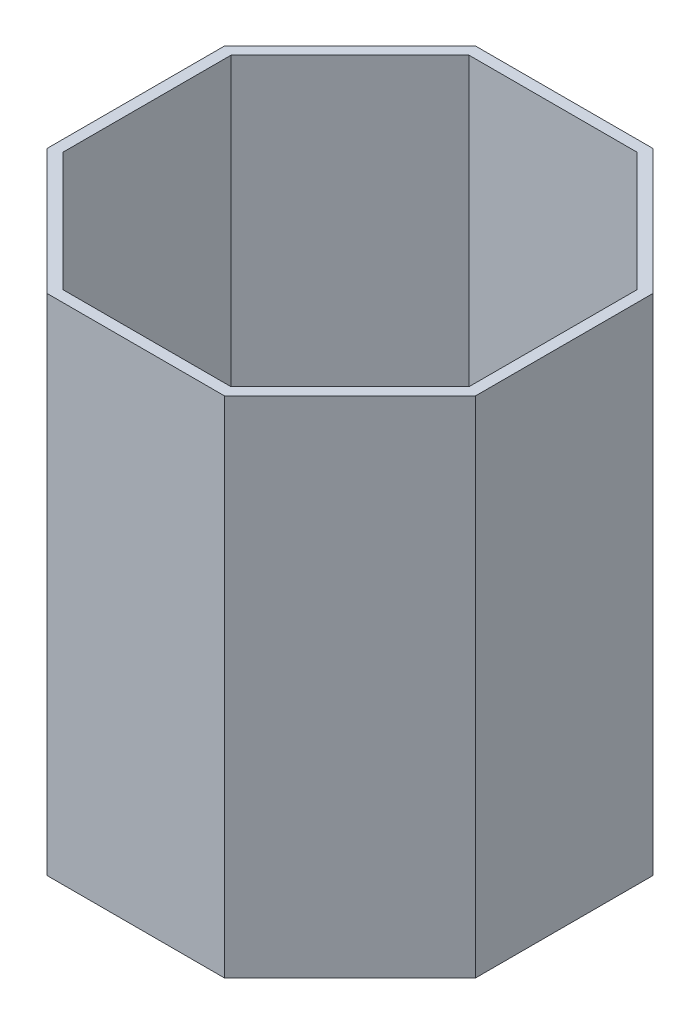
ISO-10303-21;
HEADER;
FILE_DESCRIPTION(('STEP AP214'),'2;1');
FILE_NAME('part.step','',(''),(''),'','','');
FILE_SCHEMA(('AUTOMOTIVE_DESIGN { 1 0 10303 214 1 1 1 1 }'));
ENDSEC;
DATA;
#1=APPLICATION_CONTEXT('core data for automotive mechanical design processes');
#2=APPLICATION_PROTOCOL_DEFINITION('international standard','automotive_design',2000,#1);
#3=PRODUCT_CONTEXT('',#1,'mechanical');
#4=PRODUCT('Part','Part','',(#3));
#5=PRODUCT_RELATED_PRODUCT_CATEGORY('part','',(#4));
#6=PRODUCT_DEFINITION_FORMATION('','',#4);
#7=PRODUCT_DEFINITION_CONTEXT('part definition',#1,'design');
#8=PRODUCT_DEFINITION('design','',#6,#7);
#9=PRODUCT_DEFINITION_SHAPE('','',#8);
#10=(LENGTH_UNIT() NAMED_UNIT(*) SI_UNIT(.MILLI.,.METRE.));
#11=(NAMED_UNIT(*) PLANE_ANGLE_UNIT() SI_UNIT($,.RADIAN.));
#12=(NAMED_UNIT(*) SI_UNIT($,.STERADIAN.) SOLID_ANGLE_UNIT());
#13=UNCERTAINTY_MEASURE_WITH_UNIT(LENGTH_MEASURE(1.E-05),#10,'distance_accuracy_value','');
#14=(GEOMETRIC_REPRESENTATION_CONTEXT(3) GLOBAL_UNCERTAINTY_ASSIGNED_CONTEXT((#13)) GLOBAL_UNIT_ASSIGNED_CONTEXT((#10,
#11,#12)) REPRESENTATION_CONTEXT('',''));
#15=CARTESIAN_POINT('',(0.,0.,0.));
#16=DIRECTION('',(0.,0.,1.));
#17=DIRECTION('',(1.,0.,0.));
#18=AXIS2_PLACEMENT_3D('',#15,#16,#17);
#19=CARTESIAN_POINT('',(0.,180.,0.));
#20=DIRECTION('',(0.,1.,0.));
#21=DIRECTION('',(0.,0.,1.));
#22=AXIS2_PLACEMENT_3D('',#19,#20,#21);
#23=PLANE('',#22);
#24=DIRECTION('',(-0.707106781186548,0.,0.707106781186548));
#25=VECTOR('',#24,1.);
#26=CARTESIAN_POINT('',(-31.6873375215418,180.,-76.5));
#27=LINE('',#26,#25);
#28=CARTESIAN_POINT('',(-31.6873375215418,180.,-76.5));
#29=VERTEX_POINT('',#28);
#30=CARTESIAN_POINT('',(-76.5,180.,-31.6873375215418));
#31=VERTEX_POINT('',#30);
#32=EDGE_CURVE('E213',#29,#31,#27,.T.);
#33=ORIENTED_EDGE('',*,*,#32,.T.);
#34=DIRECTION('',(0.,0.,1.));
#35=VECTOR('',#34,1.);
#36=CARTESIAN_POINT('',(-76.5,180.,-31.6873375215418));
#37=LINE('',#36,#35);
#38=CARTESIAN_POINT('',(-76.5,180.,31.6873375215418));
#39=VERTEX_POINT('',#38);
#40=EDGE_CURVE('E216',#31,#39,#37,.T.);
#41=ORIENTED_EDGE('',*,*,#40,.T.);
#42=DIRECTION('',(0.707106781186547,0.,0.707106781186548));
#43=VECTOR('',#42,1.);
#44=CARTESIAN_POINT('',(-76.5,180.,31.6873375215418));
#45=LINE('',#44,#43);
#46=CARTESIAN_POINT('',(-31.6873375215418,180.,76.5));
#47=VERTEX_POINT('',#46);
#48=EDGE_CURVE('E219',#39,#47,#45,.T.);
#49=ORIENTED_EDGE('',*,*,#48,.T.);
#50=DIRECTION('',(1.,0.,0.));
#51=VECTOR('',#50,1.);
#52=CARTESIAN_POINT('',(-31.6873375215418,180.,76.5));
#53=LINE('',#52,#51);
#54=CARTESIAN_POINT('',(31.6873375215418,180.,76.5));
#55=VERTEX_POINT('',#54);
#56=EDGE_CURVE('E221',#47,#55,#53,.T.);
#57=ORIENTED_EDGE('',*,*,#56,.T.);
#58=DIRECTION('',(0.707106781186547,0.,-0.707106781186548));
#59=VECTOR('',#58,1.);
#60=CARTESIAN_POINT('',(31.6873375215418,180.,76.5));
#61=LINE('',#60,#59);
#62=CARTESIAN_POINT('',(76.5,180.,31.6873375215418));
#63=VERTEX_POINT('',#62);
#64=EDGE_CURVE('E223',#55,#63,#61,.T.);
#65=ORIENTED_EDGE('',*,*,#64,.T.);
#66=DIRECTION('',(0.,0.,-1.));
#67=VECTOR('',#66,1.);
#68=CARTESIAN_POINT('',(76.5,180.,31.6873375215418));
#69=LINE('',#68,#67);
#70=CARTESIAN_POINT('',(76.5,180.,-31.6873375215418));
#71=VERTEX_POINT('',#70);
#72=EDGE_CURVE('E225',#63,#71,#69,.T.);
#73=ORIENTED_EDGE('',*,*,#72,.T.);
#74=DIRECTION('',(-0.707106781186548,0.,-0.707106781186548));
#75=VECTOR('',#74,1.);
#76=CARTESIAN_POINT('',(76.5,180.,-31.6873375215418));
#77=LINE('',#76,#75);
#78=CARTESIAN_POINT('',(31.6873375215418,180.,-76.5));
#79=VERTEX_POINT('',#78);
#80=EDGE_CURVE('E227',#71,#79,#77,.T.);
#81=ORIENTED_EDGE('',*,*,#80,.T.);
#82=DIRECTION('',(-1.,0.,0.));
#83=VECTOR('',#82,1.);
#84=CARTESIAN_POINT('',(31.6873375215418,180.,-76.5));
#85=LINE('',#84,#83);
#86=EDGE_CURVE('E229',#79,#29,#85,.T.);
#87=ORIENTED_EDGE('',*,*,#86,.T.);
#88=EDGE_LOOP('',(#33,#41,#49,#57,#65,#73,#81,#87));
#89=FACE_BOUND('',#88,.T.);
#90=DIRECTION('',(0.707106781186548,0.,0.707106781186547));
#91=VECTOR('',#90,1.);
#92=CARTESIAN_POINT('',(-72.5,180.,30.0304832720494));
#93=LINE('',#92,#91);
#94=CARTESIAN_POINT('',(-72.5,180.,30.0304832720494));
#95=VERTEX_POINT('',#94);
#96=CARTESIAN_POINT('',(-30.0304832720494,180.,72.5));
#97=VERTEX_POINT('',#96);
#98=EDGE_CURVE('E156',#95,#97,#93,.T.);
#99=ORIENTED_EDGE('',*,*,#98,.F.);
#100=DIRECTION('',(0.,0.,1.));
#101=VECTOR('',#100,1.);
#102=CARTESIAN_POINT('',(-72.5,180.,-30.0304832720494));
#103=LINE('',#102,#101);
#104=CARTESIAN_POINT('',(-72.5,180.,-30.0304832720494));
#105=VERTEX_POINT('',#104);
#106=EDGE_CURVE('E148',#105,#95,#103,.T.);
#107=ORIENTED_EDGE('',*,*,#106,.F.);
#108=DIRECTION('',(-0.707106781186548,0.,0.707106781186547));
#109=VECTOR('',#108,1.);
#110=CARTESIAN_POINT('',(-30.0304832720494,180.,-72.5));
#111=LINE('',#110,#109);
#112=CARTESIAN_POINT('',(-30.0304832720494,180.,-72.5));
#113=VERTEX_POINT('',#112);
#114=EDGE_CURVE('E181',#113,#105,#111,.T.);
#115=ORIENTED_EDGE('',*,*,#114,.F.);
#116=DIRECTION('',(-1.,0.,0.));
#117=VECTOR('',#116,1.);
#118=CARTESIAN_POINT('',(30.0304832720494,180.,-72.5));
#119=LINE('',#118,#117);
#120=CARTESIAN_POINT('',(30.0304832720494,180.,-72.5));
#121=VERTEX_POINT('',#120);
#122=EDGE_CURVE('E179',#121,#113,#119,.T.);
#123=ORIENTED_EDGE('',*,*,#122,.F.);
#124=DIRECTION('',(-0.707106781186548,0.,-0.707106781186547));
#125=VECTOR('',#124,1.);
#126=CARTESIAN_POINT('',(72.5,180.,-30.0304832720495));
#127=LINE('',#126,#125);
#128=CARTESIAN_POINT('',(72.5,180.,-30.0304832720495));
#129=VERTEX_POINT('',#128);
#130=EDGE_CURVE('E177',#129,#121,#127,.T.);
#131=ORIENTED_EDGE('',*,*,#130,.F.);
#132=DIRECTION('',(0.,0.,-1.));
#133=VECTOR('',#132,1.);
#134=CARTESIAN_POINT('',(72.5,180.,30.0304832720494));
#135=LINE('',#134,#133);
#136=CARTESIAN_POINT('',(72.5,180.,30.0304832720494));
#137=VERTEX_POINT('',#136);
#138=EDGE_CURVE('E175',#137,#129,#135,.T.);
#139=ORIENTED_EDGE('',*,*,#138,.F.);
#140=DIRECTION('',(0.707106781186547,0.,-0.707106781186548));
#141=VECTOR('',#140,1.);
#142=CARTESIAN_POINT('',(30.0304832720495,180.,72.5));
#143=LINE('',#142,#141);
#144=CARTESIAN_POINT('',(30.0304832720495,180.,72.5));
#145=VERTEX_POINT('',#144);
#146=EDGE_CURVE('E171',#145,#137,#143,.T.);
#147=ORIENTED_EDGE('',*,*,#146,.F.);
#148=DIRECTION('',(1.,0.,0.));
#149=VECTOR('',#148,1.);
#150=CARTESIAN_POINT('',(-30.0304832720494,180.,72.5));
#151=LINE('',#150,#149);
#152=EDGE_CURVE('E169',#97,#145,#151,.T.);
#153=ORIENTED_EDGE('',*,*,#152,.F.);
#154=EDGE_LOOP('',(#99,#107,#115,#123,#131,#139,#147,#153));
#155=FACE_BOUND('',#154,.T.);
#156=ADVANCED_FACE('F35',(#89,#155),#23,.T.);
#157=CARTESIAN_POINT('',(0.,0.,0.));
#158=DIRECTION('',(0.,1.,0.));
#159=DIRECTION('',(0.,0.,1.));
#160=AXIS2_PLACEMENT_3D('',#157,#158,#159);
#161=PLANE('',#160);
#162=DIRECTION('',(-0.707106781186548,0.,0.707106781186548));
#163=VECTOR('',#162,1.);
#164=CARTESIAN_POINT('',(-31.6873375215418,0.,-76.5));
#165=LINE('',#164,#163);
#166=CARTESIAN_POINT('',(-31.6873375215418,0.,-76.5));
#167=VERTEX_POINT('',#166);
#168=CARTESIAN_POINT('',(-76.5,0.,-31.6873375215418));
#169=VERTEX_POINT('',#168);
#170=EDGE_CURVE('E164',#167,#169,#165,.T.);
#171=ORIENTED_EDGE('',*,*,#170,.F.);
#172=DIRECTION('',(-1.,0.,0.));
#173=VECTOR('',#172,1.);
#174=CARTESIAN_POINT('',(31.6873375215418,0.,-76.5));
#175=LINE('',#174,#173);
#176=CARTESIAN_POINT('',(31.6873375215418,0.,-76.5));
#177=VERTEX_POINT('',#176);
#178=EDGE_CURVE('E217',#177,#167,#175,.T.);
#179=ORIENTED_EDGE('',*,*,#178,.F.);
#180=DIRECTION('',(-0.707106781186548,0.,-0.707106781186548));
#181=VECTOR('',#180,1.);
#182=CARTESIAN_POINT('',(76.5,0.,-31.6873375215418));
#183=LINE('',#182,#181);
#184=CARTESIAN_POINT('',(76.5,0.,-31.6873375215418));
#185=VERTEX_POINT('',#184);
#186=EDGE_CURVE('E244',#185,#177,#183,.T.);
#187=ORIENTED_EDGE('',*,*,#186,.F.);
#188=DIRECTION('',(0.,0.,-1.));
#189=VECTOR('',#188,1.);
#190=CARTESIAN_POINT('',(76.5,0.,31.6873375215418));
#191=LINE('',#190,#189);
#192=CARTESIAN_POINT('',(76.5,0.,31.6873375215418));
#193=VERTEX_POINT('',#192);
#194=EDGE_CURVE('E242',#193,#185,#191,.T.);
#195=ORIENTED_EDGE('',*,*,#194,.F.);
#196=DIRECTION('',(0.707106781186547,0.,-0.707106781186548));
#197=VECTOR('',#196,1.);
#198=CARTESIAN_POINT('',(31.6873375215418,0.,76.5));
#199=LINE('',#198,#197);
#200=CARTESIAN_POINT('',(31.6873375215418,0.,76.5));
#201=VERTEX_POINT('',#200);
#202=EDGE_CURVE('E240',#201,#193,#199,.T.);
#203=ORIENTED_EDGE('',*,*,#202,.F.);
#204=DIRECTION('',(1.,0.,0.));
#205=VECTOR('',#204,1.);
#206=CARTESIAN_POINT('',(-31.6873375215418,0.,76.5));
#207=LINE('',#206,#205);
#208=CARTESIAN_POINT('',(-31.6873375215418,0.,76.5));
#209=VERTEX_POINT('',#208);
#210=EDGE_CURVE('E238',#209,#201,#207,.T.);
#211=ORIENTED_EDGE('',*,*,#210,.F.);
#212=DIRECTION('',(0.707106781186547,0.,0.707106781186548));
#213=VECTOR('',#212,1.);
#214=CARTESIAN_POINT('',(-76.5,0.,31.6873375215418));
#215=LINE('',#214,#213);
#216=CARTESIAN_POINT('',(-76.5,0.,31.6873375215418));
#217=VERTEX_POINT('',#216);
#218=EDGE_CURVE('E236',#217,#209,#215,.T.);
#219=ORIENTED_EDGE('',*,*,#218,.F.);
#220=DIRECTION('',(0.,0.,1.));
#221=VECTOR('',#220,1.);
#222=CARTESIAN_POINT('',(-76.5,0.,-31.6873375215418));
#223=LINE('',#222,#221);
#224=EDGE_CURVE('E234',#169,#217,#223,.T.);
#225=ORIENTED_EDGE('',*,*,#224,.F.);
#226=EDGE_LOOP('',(#171,#179,#187,#195,#203,#211,#219,#225));
#227=FACE_BOUND('',#226,.T.);
#228=DIRECTION('',(0.,0.,1.));
#229=VECTOR('',#228,1.);
#230=CARTESIAN_POINT('',(-72.5,0.,-30.0304832720494));
#231=LINE('',#230,#229);
#232=CARTESIAN_POINT('',(-72.5,0.,-30.0304832720494));
#233=VERTEX_POINT('',#232);
#234=CARTESIAN_POINT('',(-72.5,0.,30.0304832720494));
#235=VERTEX_POINT('',#234);
#236=EDGE_CURVE('E58',#233,#235,#231,.T.);
#237=ORIENTED_EDGE('',*,*,#236,.T.);
#238=DIRECTION('',(0.707106781186548,0.,0.707106781186547));
#239=VECTOR('',#238,1.);
#240=CARTESIAN_POINT('',(-72.5,0.,30.0304832720494));
#241=LINE('',#240,#239);
#242=CARTESIAN_POINT('',(-30.0304832720494,0.,72.5));
#243=VERTEX_POINT('',#242);
#244=EDGE_CURVE('E163',#235,#243,#241,.T.);
#245=ORIENTED_EDGE('',*,*,#244,.T.);
#246=DIRECTION('',(1.,0.,0.));
#247=VECTOR('',#246,1.);
#248=CARTESIAN_POINT('',(-30.0304832720494,0.,72.5));
#249=LINE('',#248,#247);
#250=CARTESIAN_POINT('',(30.0304832720495,0.,72.5));
#251=VERTEX_POINT('',#250);
#252=EDGE_CURVE('E185',#243,#251,#249,.T.);
#253=ORIENTED_EDGE('',*,*,#252,.T.);
#254=DIRECTION('',(0.707106781186547,0.,-0.707106781186548));
#255=VECTOR('',#254,1.);
#256=CARTESIAN_POINT('',(30.0304832720495,0.,72.5));
#257=LINE('',#256,#255);
#258=CARTESIAN_POINT('',(72.5,0.,30.0304832720494));
#259=VERTEX_POINT('',#258);
#260=EDGE_CURVE('E188',#251,#259,#257,.T.);
#261=ORIENTED_EDGE('',*,*,#260,.T.);
#262=DIRECTION('',(0.,0.,-1.));
#263=VECTOR('',#262,1.);
#264=CARTESIAN_POINT('',(72.5,0.,30.0304832720494));
#265=LINE('',#264,#263);
#266=CARTESIAN_POINT('',(72.5,0.,-30.0304832720495));
#267=VERTEX_POINT('',#266);
#268=EDGE_CURVE('E191',#259,#267,#265,.T.);
#269=ORIENTED_EDGE('',*,*,#268,.T.);
#270=DIRECTION('',(-0.707106781186548,0.,-0.707106781186547));
#271=VECTOR('',#270,1.);
#272=CARTESIAN_POINT('',(72.5,0.,-30.0304832720495));
#273=LINE('',#272,#271);
#274=CARTESIAN_POINT('',(30.0304832720494,0.,-72.5));
#275=VERTEX_POINT('',#274);
#276=EDGE_CURVE('E194',#267,#275,#273,.T.);
#277=ORIENTED_EDGE('',*,*,#276,.T.);
#278=DIRECTION('',(-1.,0.,0.));
#279=VECTOR('',#278,1.);
#280=CARTESIAN_POINT('',(30.0304832720494,0.,-72.5));
#281=LINE('',#280,#279);
#282=CARTESIAN_POINT('',(-30.0304832720494,0.,-72.5));
#283=VERTEX_POINT('',#282);
#284=EDGE_CURVE('E197',#275,#283,#281,.T.);
#285=ORIENTED_EDGE('',*,*,#284,.T.);
#286=DIRECTION('',(-0.707106781186548,0.,0.707106781186547));
#287=VECTOR('',#286,1.);
#288=CARTESIAN_POINT('',(-30.0304832720494,0.,-72.5));
#289=LINE('',#288,#287);
#290=EDGE_CURVE('E157',#283,#233,#289,.T.);
#291=ORIENTED_EDGE('',*,*,#290,.T.);
#292=EDGE_LOOP('',(#237,#245,#253,#261,#269,#277,#285,#291));
#293=FACE_BOUND('',#292,.T.);
#294=ADVANCED_FACE('F274',(#227,#293),#161,.F.);
#295=CARTESIAN_POINT('',(-31.6873375215418,180.,-76.5));
#296=DIRECTION('',(0.707106781186547,0.,0.707106781186547));
#297=DIRECTION('',(0.707106781186548,0.,-0.707106781186547));
#298=AXIS2_PLACEMENT_3D('',#295,#296,#297);
#299=PLANE('',#298);
#300=ORIENTED_EDGE('',*,*,#170,.T.);
#301=DIRECTION('',(0.,-1.,0.));
#302=VECTOR('',#301,1.);
#303=CARTESIAN_POINT('',(-76.5,180.,-31.6873375215418));
#304=LINE('',#303,#302);
#305=EDGE_CURVE('E11',#31,#169,#304,.T.);
#306=ORIENTED_EDGE('',*,*,#305,.F.);
#307=ORIENTED_EDGE('',*,*,#32,.F.);
#308=DIRECTION('',(0.,-1.,0.));
#309=VECTOR('',#308,1.);
#310=CARTESIAN_POINT('',(-31.6873375215418,180.,-76.5));
#311=LINE('',#310,#309);
#312=EDGE_CURVE('E231',#29,#167,#311,.T.);
#313=ORIENTED_EDGE('',*,*,#312,.T.);
#314=EDGE_LOOP('',(#300,#306,#307,#313));
#315=FACE_BOUND('',#314,.T.);
#316=ADVANCED_FACE('F37',(#315),#299,.F.);
#317=CARTESIAN_POINT('',(-76.5,180.,-31.6873375215418));
#318=DIRECTION('',(1.,0.,0.));
#319=DIRECTION('',(0.,0.,-1.));
#320=AXIS2_PLACEMENT_3D('',#317,#318,#319);
#321=PLANE('',#320);
#322=ORIENTED_EDGE('',*,*,#224,.T.);
#323=DIRECTION('',(0.,-1.,0.));
#324=VECTOR('',#323,1.);
#325=CARTESIAN_POINT('',(-76.5,180.,31.6873375215418));
#326=LINE('',#325,#324);
#327=EDGE_CURVE('E43',#39,#217,#326,.T.);
#328=ORIENTED_EDGE('',*,*,#327,.F.);
#329=ORIENTED_EDGE('',*,*,#40,.F.);
#330=ORIENTED_EDGE('',*,*,#305,.T.);
#331=EDGE_LOOP('',(#322,#328,#329,#330));
#332=FACE_BOUND('',#331,.T.);
#333=ADVANCED_FACE('F291',(#332),#321,.F.);
#334=CARTESIAN_POINT('',(-76.5,180.,31.6873375215418));
#335=DIRECTION('',(0.707106781186547,0.,-0.707106781186547));
#336=DIRECTION('',(-0.707106781186548,0.,-0.707106781186548));
#337=AXIS2_PLACEMENT_3D('',#334,#335,#336);
#338=PLANE('',#337);
#339=ORIENTED_EDGE('',*,*,#218,.T.);
#340=DIRECTION('',(0.,-1.,0.));
#341=VECTOR('',#340,1.);
#342=CARTESIAN_POINT('',(-31.6873375215418,180.,76.5));
#343=LINE('',#342,#341);
#344=EDGE_CURVE('E261',#47,#209,#343,.T.);
#345=ORIENTED_EDGE('',*,*,#344,.F.);
#346=ORIENTED_EDGE('',*,*,#48,.F.);
#347=ORIENTED_EDGE('',*,*,#327,.T.);
#348=EDGE_LOOP('',(#339,#345,#346,#347));
#349=FACE_BOUND('',#348,.T.);
#350=ADVANCED_FACE('F268',(#349),#338,.F.);
#351=CARTESIAN_POINT('',(-31.6873375215418,180.,76.5));
#352=DIRECTION('',(0.,0.,-1.));
#353=DIRECTION('',(-1.,0.,0.));
#354=AXIS2_PLACEMENT_3D('',#351,#352,#353);
#355=PLANE('',#354);
#356=ORIENTED_EDGE('',*,*,#210,.T.);
#357=DIRECTION('',(0.,-1.,0.));
#358=VECTOR('',#357,1.);
#359=CARTESIAN_POINT('',(31.6873375215418,180.,76.5));
#360=LINE('',#359,#358);
#361=EDGE_CURVE('E258',#55,#201,#360,.T.);
#362=ORIENTED_EDGE('',*,*,#361,.F.);
#363=ORIENTED_EDGE('',*,*,#56,.F.);
#364=ORIENTED_EDGE('',*,*,#344,.T.);
#365=EDGE_LOOP('',(#356,#362,#363,#364));
#366=FACE_BOUND('',#365,.T.);
#367=ADVANCED_FACE('F280',(#366),#355,.F.);
#368=CARTESIAN_POINT('',(31.6873375215418,180.,76.5));
#369=DIRECTION('',(-0.707106781186547,0.,-0.707106781186547));
#370=DIRECTION('',(-0.707106781186547,0.,0.707106781186548));
#371=AXIS2_PLACEMENT_3D('',#368,#369,#370);
#372=PLANE('',#371);
#373=ORIENTED_EDGE('',*,*,#202,.T.);
#374=DIRECTION('',(0.,-1.,0.));
#375=VECTOR('',#374,1.);
#376=CARTESIAN_POINT('',(76.5,180.,31.6873375215418));
#377=LINE('',#376,#375);
#378=EDGE_CURVE('E255',#63,#193,#377,.T.);
#379=ORIENTED_EDGE('',*,*,#378,.F.);
#380=ORIENTED_EDGE('',*,*,#64,.F.);
#381=ORIENTED_EDGE('',*,*,#361,.T.);
#382=EDGE_LOOP('',(#373,#379,#380,#381));
#383=FACE_BOUND('',#382,.T.);
#384=ADVANCED_FACE('F284',(#383),#372,.F.);
#385=CARTESIAN_POINT('',(76.5,180.,31.6873375215418));
#386=DIRECTION('',(-1.,0.,0.));
#387=DIRECTION('',(0.,0.,1.));
#388=AXIS2_PLACEMENT_3D('',#385,#386,#387);
#389=PLANE('',#388);
#390=ORIENTED_EDGE('',*,*,#194,.T.);
#391=DIRECTION('',(0.,-1.,0.));
#392=VECTOR('',#391,1.);
#393=CARTESIAN_POINT('',(76.5,180.,-31.6873375215418));
#394=LINE('',#393,#392);
#395=EDGE_CURVE('E252',#71,#185,#394,.T.);
#396=ORIENTED_EDGE('',*,*,#395,.F.);
#397=ORIENTED_EDGE('',*,*,#72,.F.);
#398=ORIENTED_EDGE('',*,*,#378,.T.);
#399=EDGE_LOOP('',(#390,#396,#397,#398));
#400=FACE_BOUND('',#399,.T.);
#401=ADVANCED_FACE('F304',(#400),#389,.F.);
#402=CARTESIAN_POINT('',(76.5,180.,-31.6873375215418));
#403=DIRECTION('',(-0.707106781186547,0.,0.707106781186547));
#404=DIRECTION('',(0.707106781186548,0.,0.707106781186548));
#405=AXIS2_PLACEMENT_3D('',#402,#403,#404);
#406=PLANE('',#405);
#407=ORIENTED_EDGE('',*,*,#186,.T.);
#408=DIRECTION('',(0.,-1.,0.));
#409=VECTOR('',#408,1.);
#410=CARTESIAN_POINT('',(31.6873375215418,180.,-76.5));
#411=LINE('',#410,#409);
#412=EDGE_CURVE('E249',#79,#177,#411,.T.);
#413=ORIENTED_EDGE('',*,*,#412,.F.);
#414=ORIENTED_EDGE('',*,*,#80,.F.);
#415=ORIENTED_EDGE('',*,*,#395,.T.);
#416=EDGE_LOOP('',(#407,#413,#414,#415));
#417=FACE_BOUND('',#416,.T.);
#418=ADVANCED_FACE('F302',(#417),#406,.F.);
#419=CARTESIAN_POINT('',(31.6873375215418,180.,-76.5));
#420=DIRECTION('',(0.,0.,1.));
#421=DIRECTION('',(1.,0.,0.));
#422=AXIS2_PLACEMENT_3D('',#419,#420,#421);
#423=PLANE('',#422);
#424=ORIENTED_EDGE('',*,*,#178,.T.);
#425=ORIENTED_EDGE('',*,*,#312,.F.);
#426=ORIENTED_EDGE('',*,*,#86,.F.);
#427=ORIENTED_EDGE('',*,*,#412,.T.);
#428=EDGE_LOOP('',(#424,#425,#426,#427));
#429=FACE_BOUND('',#428,.T.);
#430=ADVANCED_FACE('F297',(#429),#423,.F.);
#431=CARTESIAN_POINT('',(-72.5,180.,-30.0304832720494));
#432=DIRECTION('',(1.,0.,0.));
#433=DIRECTION('',(0.,0.,-1.));
#434=AXIS2_PLACEMENT_3D('',#431,#432,#433);
#435=PLANE('',#434);
#436=ORIENTED_EDGE('',*,*,#236,.F.);
#437=DIRECTION('',(0.,-1.,0.));
#438=VECTOR('',#437,1.);
#439=CARTESIAN_POINT('',(-72.5,180.,-30.0304832720494));
#440=LINE('',#439,#438);
#441=EDGE_CURVE('E152',#105,#233,#440,.T.);
#442=ORIENTED_EDGE('',*,*,#441,.F.);
#443=ORIENTED_EDGE('',*,*,#106,.T.);
#444=DIRECTION('',(0.,-1.,0.));
#445=VECTOR('',#444,1.);
#446=CARTESIAN_POINT('',(-72.5,180.,30.0304832720494));
#447=LINE('',#446,#445);
#448=EDGE_CURVE('E151',#95,#235,#447,.T.);
#449=ORIENTED_EDGE('',*,*,#448,.T.);
#450=EDGE_LOOP('',(#436,#442,#443,#449));
#451=FACE_BOUND('',#450,.T.);
#452=ADVANCED_FACE('F150',(#451),#435,.T.);
#453=CARTESIAN_POINT('',(-72.5,180.,30.0304832720494));
#454=DIRECTION('',(0.707106781186547,0.,-0.707106781186548));
#455=DIRECTION('',(-0.707106781186548,0.,-0.707106781186547));
#456=AXIS2_PLACEMENT_3D('',#453,#454,#455);
#457=PLANE('',#456);
#458=ORIENTED_EDGE('',*,*,#244,.F.);
#459=ORIENTED_EDGE('',*,*,#448,.F.);
#460=ORIENTED_EDGE('',*,*,#98,.T.);
#461=DIRECTION('',(0.,-1.,0.));
#462=VECTOR('',#461,1.);
#463=CARTESIAN_POINT('',(-30.0304832720494,180.,72.5));
#464=LINE('',#463,#462);
#465=EDGE_CURVE('E165',#97,#243,#464,.T.);
#466=ORIENTED_EDGE('',*,*,#465,.T.);
#467=EDGE_LOOP('',(#458,#459,#460,#466));
#468=FACE_BOUND('',#467,.T.);
#469=ADVANCED_FACE('F160',(#468),#457,.T.);
#470=CARTESIAN_POINT('',(-30.0304832720494,180.,72.5));
#471=DIRECTION('',(0.,0.,-1.));
#472=DIRECTION('',(-1.,0.,0.));
#473=AXIS2_PLACEMENT_3D('',#470,#471,#472);
#474=PLANE('',#473);
#475=ORIENTED_EDGE('',*,*,#252,.F.);
#476=ORIENTED_EDGE('',*,*,#465,.F.);
#477=ORIENTED_EDGE('',*,*,#152,.T.);
#478=DIRECTION('',(0.,-1.,0.));
#479=VECTOR('',#478,1.);
#480=CARTESIAN_POINT('',(30.0304832720495,180.,72.5));
#481=LINE('',#480,#479);
#482=EDGE_CURVE('E210',#145,#251,#481,.T.);
#483=ORIENTED_EDGE('',*,*,#482,.T.);
#484=EDGE_LOOP('',(#475,#476,#477,#483));
#485=FACE_BOUND('',#484,.T.);
#486=ADVANCED_FACE('F329',(#485),#474,.T.);
#487=CARTESIAN_POINT('',(30.0304832720495,180.,72.5));
#488=DIRECTION('',(-0.707106781186547,0.,-0.707106781186547));
#489=DIRECTION('',(-0.707106781186547,0.,0.707106781186548));
#490=AXIS2_PLACEMENT_3D('',#487,#488,#489);
#491=PLANE('',#490);
#492=ORIENTED_EDGE('',*,*,#260,.F.);
#493=ORIENTED_EDGE('',*,*,#482,.F.);
#494=ORIENTED_EDGE('',*,*,#146,.T.);
#495=DIRECTION('',(0.,-1.,0.));
#496=VECTOR('',#495,1.);
#497=CARTESIAN_POINT('',(72.5,180.,30.0304832720494));
#498=LINE('',#497,#496);
#499=EDGE_CURVE('E208',#137,#259,#498,.T.);
#500=ORIENTED_EDGE('',*,*,#499,.T.);
#501=EDGE_LOOP('',(#492,#493,#494,#500));
#502=FACE_BOUND('',#501,.T.);
#503=ADVANCED_FACE('F333',(#502),#491,.T.);
#504=CARTESIAN_POINT('',(72.5,180.,30.0304832720494));
#505=DIRECTION('',(-1.,0.,0.));
#506=DIRECTION('',(0.,0.,1.));
#507=AXIS2_PLACEMENT_3D('',#504,#505,#506);
#508=PLANE('',#507);
#509=ORIENTED_EDGE('',*,*,#268,.F.);
#510=ORIENTED_EDGE('',*,*,#499,.F.);
#511=ORIENTED_EDGE('',*,*,#138,.T.);
#512=DIRECTION('',(0.,-1.,0.));
#513=VECTOR('',#512,1.);
#514=CARTESIAN_POINT('',(72.5,180.,-30.0304832720495));
#515=LINE('',#514,#513);
#516=EDGE_CURVE('E206',#129,#267,#515,.T.);
#517=ORIENTED_EDGE('',*,*,#516,.T.);
#518=EDGE_LOOP('',(#509,#510,#511,#517));
#519=FACE_BOUND('',#518,.T.);
#520=ADVANCED_FACE('F339',(#519),#508,.T.);
#521=CARTESIAN_POINT('',(72.5,180.,-30.0304832720495));
#522=DIRECTION('',(-0.707106781186547,0.,0.707106781186547));
#523=DIRECTION('',(0.707106781186548,0.,0.707106781186548));
#524=AXIS2_PLACEMENT_3D('',#521,#522,#523);
#525=PLANE('',#524);
#526=ORIENTED_EDGE('',*,*,#276,.F.);
#527=ORIENTED_EDGE('',*,*,#516,.F.);
#528=ORIENTED_EDGE('',*,*,#130,.T.);
#529=DIRECTION('',(0.,-1.,0.));
#530=VECTOR('',#529,1.);
#531=CARTESIAN_POINT('',(30.0304832720494,180.,-72.5));
#532=LINE('',#531,#530);
#533=EDGE_CURVE('E204',#121,#275,#532,.T.);
#534=ORIENTED_EDGE('',*,*,#533,.T.);
#535=EDGE_LOOP('',(#526,#527,#528,#534));
#536=FACE_BOUND('',#535,.T.);
#537=ADVANCED_FACE('F343',(#536),#525,.T.);
#538=CARTESIAN_POINT('',(30.0304832720494,180.,-72.5));
#539=DIRECTION('',(0.,0.,1.));
#540=DIRECTION('',(1.,0.,0.));
#541=AXIS2_PLACEMENT_3D('',#538,#539,#540);
#542=PLANE('',#541);
#543=ORIENTED_EDGE('',*,*,#284,.F.);
#544=ORIENTED_EDGE('',*,*,#533,.F.);
#545=ORIENTED_EDGE('',*,*,#122,.T.);
#546=DIRECTION('',(0.,-1.,0.));
#547=VECTOR('',#546,1.);
#548=CARTESIAN_POINT('',(-30.0304832720494,180.,-72.5));
#549=LINE('',#548,#547);
#550=EDGE_CURVE('E50',#113,#283,#549,.T.);
#551=ORIENTED_EDGE('',*,*,#550,.T.);
#552=EDGE_LOOP('',(#543,#544,#545,#551));
#553=FACE_BOUND('',#552,.T.);
#554=ADVANCED_FACE('F347',(#553),#542,.T.);
#555=CARTESIAN_POINT('',(-30.0304832720494,180.,-72.5));
#556=DIRECTION('',(0.707106781186547,0.,0.707106781186548));
#557=DIRECTION('',(0.707106781186548,0.,-0.707106781186547));
#558=AXIS2_PLACEMENT_3D('',#555,#556,#557);
#559=PLANE('',#558);
#560=ORIENTED_EDGE('',*,*,#290,.F.);
#561=ORIENTED_EDGE('',*,*,#550,.F.);
#562=ORIENTED_EDGE('',*,*,#114,.T.);
#563=ORIENTED_EDGE('',*,*,#441,.T.);
#564=EDGE_LOOP('',(#560,#561,#562,#563));
#565=FACE_BOUND('',#564,.T.);
#566=ADVANCED_FACE('F351',(#565),#559,.T.);
#567=CLOSED_SHELL('',(#156,#294,#316,#333,#350,#367,#384,#401,#418,#430,#452,#469,#486,#503,
#520,#537,#554,#566));
#568=MANIFOLD_SOLID_BREP('B2',#567);
#569=ADVANCED_BREP_SHAPE_REPRESENTATION('',(#18,#568),#14);
#570=SHAPE_DEFINITION_REPRESENTATION(#9,#569);
ENDSEC;
END-ISO-10303-21;
